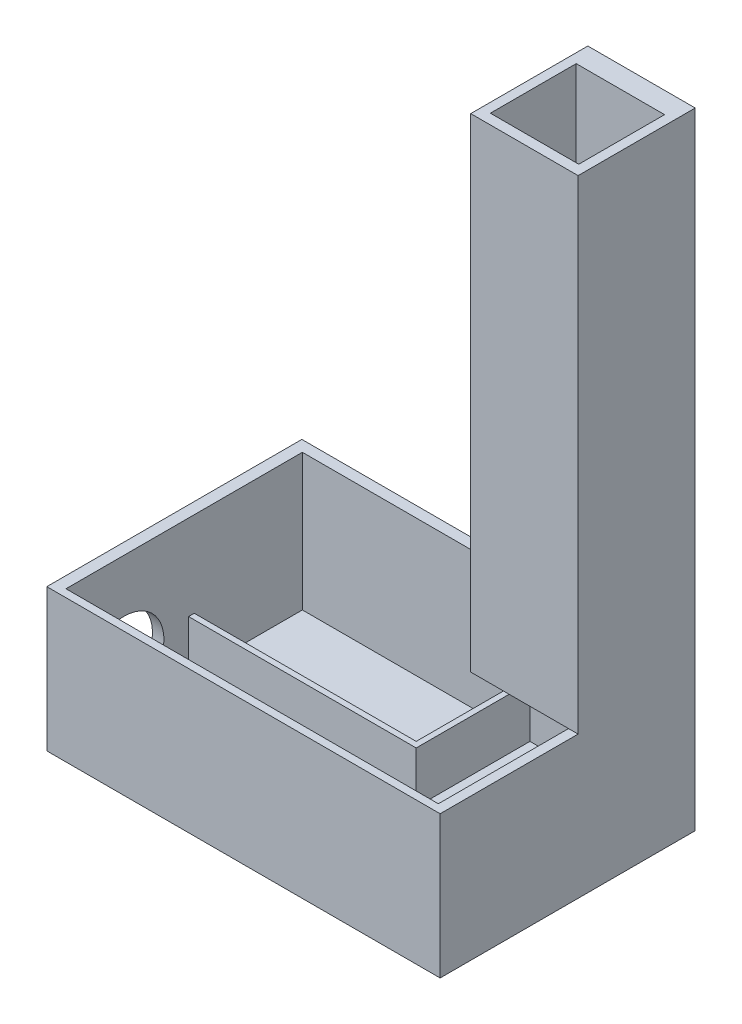
ISO-10303-21;
HEADER;
FILE_DESCRIPTION(('STEP AP214'),'2;1');
FILE_NAME('part.step','',(''),(''),'','','');
FILE_SCHEMA(('AUTOMOTIVE_DESIGN { 1 0 10303 214 1 1 1 1 }'));
ENDSEC;
DATA;
#1=APPLICATION_CONTEXT('core data for automotive mechanical design processes');
#2=APPLICATION_PROTOCOL_DEFINITION('international standard','automotive_design',2000,#1);
#3=PRODUCT_CONTEXT('',#1,'mechanical');
#4=PRODUCT('Part','Part','',(#3));
#5=PRODUCT_RELATED_PRODUCT_CATEGORY('part','',(#4));
#6=PRODUCT_DEFINITION_FORMATION('','',#4);
#7=PRODUCT_DEFINITION_CONTEXT('part definition',#1,'design');
#8=PRODUCT_DEFINITION('design','',#6,#7);
#9=PRODUCT_DEFINITION_SHAPE('','',#8);
#10=(LENGTH_UNIT() NAMED_UNIT(*) SI_UNIT(.MILLI.,.METRE.));
#11=(NAMED_UNIT(*) PLANE_ANGLE_UNIT() SI_UNIT($,.RADIAN.));
#12=(NAMED_UNIT(*) SI_UNIT($,.STERADIAN.) SOLID_ANGLE_UNIT());
#13=UNCERTAINTY_MEASURE_WITH_UNIT(LENGTH_MEASURE(1.E-05),#10,'distance_accuracy_value','');
#14=(GEOMETRIC_REPRESENTATION_CONTEXT(3) GLOBAL_UNCERTAINTY_ASSIGNED_CONTEXT((#13)) GLOBAL_UNIT_ASSIGNED_CONTEXT((#10,
#11,#12)) REPRESENTATION_CONTEXT('',''));
#15=CARTESIAN_POINT('',(0.,0.,0.));
#16=DIRECTION('',(0.,0.,1.));
#17=DIRECTION('',(1.,0.,0.));
#18=AXIS2_PLACEMENT_3D('',#15,#16,#17);
#19=CARTESIAN_POINT('',(0.,0.200000000000001,0.));
#20=DIRECTION('',(0.,1.,0.));
#21=DIRECTION('',(0.,0.,1.));
#22=AXIS2_PLACEMENT_3D('',#19,#20,#21);
#23=PLANE('',#22);
#24=DIRECTION('',(1.,0.,0.));
#25=VECTOR('',#24,1.);
#26=CARTESIAN_POINT('',(0.,0.200000000000001,4.18326309861247));
#27=LINE('',#26,#25);
#28=CARTESIAN_POINT('',(0.401261320917001,0.200000000000001,4.18326309861247));
#29=VERTEX_POINT('',#28);
#30=CARTESIAN_POINT('',(8.201261320917,0.200000000000001,4.18326309861247));
#31=VERTEX_POINT('',#30);
#32=EDGE_CURVE('E374',#29,#31,#27,.T.);
#33=ORIENTED_EDGE('',*,*,#32,.T.);
#34=DIRECTION('',(0.,0.,1.));
#35=VECTOR('',#34,1.);
#36=CARTESIAN_POINT('',(8.201261320917,0.200000000000001,0.));
#37=LINE('',#36,#35);
#38=CARTESIAN_POINT('',(8.201261320917,0.200000000000001,0.383263098612474));
#39=VERTEX_POINT('',#38);
#40=EDGE_CURVE('E371',#39,#31,#37,.T.);
#41=ORIENTED_EDGE('',*,*,#40,.F.);
#42=DIRECTION('',(-1.,0.,0.));
#43=VECTOR('',#42,1.);
#44=CARTESIAN_POINT('',(0.401261320917001,0.200000000000001,0.383263098612474));
#45=LINE('',#44,#43);
#46=CARTESIAN_POINT('',(0.401261320917001,0.200000000000001,0.383263098612474));
#47=VERTEX_POINT('',#46);
#48=EDGE_CURVE('E403',#39,#47,#45,.T.);
#49=ORIENTED_EDGE('',*,*,#48,.T.);
#50=DIRECTION('',(0.,0.,1.));
#51=VECTOR('',#50,1.);
#52=CARTESIAN_POINT('',(0.401261320917001,0.200000000000001,0.383263098612474));
#53=LINE('',#52,#51);
#54=EDGE_CURVE('E393',#47,#29,#53,.T.);
#55=ORIENTED_EDGE('',*,*,#54,.T.);
#56=EDGE_LOOP('',(#33,#41,#49,#55));
#57=FACE_BOUND('',#56,.T.);
#58=ADVANCED_FACE('F37',(#57),#23,.T.);
#59=CARTESIAN_POINT('',(0.,5.,0.));
#60=DIRECTION('',(1.,0.,0.));
#61=DIRECTION('',(0.,0.,-1.));
#62=AXIS2_PLACEMENT_3D('',#59,#60,#61);
#63=PLANE('',#62);
#64=CARTESIAN_POINT('',(0.,1.74231817794634,6.65194334569197));
#65=DIRECTION('',(-1.,0.,0.));
#66=DIRECTION('',(0.,0.,1.));
#67=AXIS2_PLACEMENT_3D('',#64,#65,#66);
#68=CIRCLE('',#67,1.4);
#69=CARTESIAN_POINT('',(0.,1.74231817794634,8.05194334569197));
#70=VERTEX_POINT('',#69);
#71=EDGE_CURVE('E342',#70,#70,#68,.T.);
#72=ORIENTED_EDGE('',*,*,#71,.F.);
#73=EDGE_LOOP('',(#72));
#74=FACE_BOUND('',#73,.T.);
#75=DIRECTION('',(0.,0.,1.));
#76=VECTOR('',#75,1.);
#77=CARTESIAN_POINT('',(0.,0.,0.));
#78=LINE('',#77,#76);
#79=CARTESIAN_POINT('',(0.,0.,0.));
#80=VERTEX_POINT('',#79);
#81=CARTESIAN_POINT('',(0.,0.,8.96494916138802));
#82=VERTEX_POINT('',#81);
#83=EDGE_CURVE('E423',#80,#82,#78,.T.);
#84=ORIENTED_EDGE('',*,*,#83,.T.);
#85=DIRECTION('',(0.,-1.,0.));
#86=VECTOR('',#85,1.);
#87=CARTESIAN_POINT('',(0.,5.,8.96494916138802));
#88=LINE('',#87,#86);
#89=CARTESIAN_POINT('',(0.,5.,8.96494916138802));
#90=VERTEX_POINT('',#89);
#91=EDGE_CURVE('E457',#90,#82,#88,.T.);
#92=ORIENTED_EDGE('',*,*,#91,.F.);
#93=DIRECTION('',(0.,0.,1.));
#94=VECTOR('',#93,1.);
#95=CARTESIAN_POINT('',(0.,5.,0.));
#96=LINE('',#95,#94);
#97=CARTESIAN_POINT('',(0.,5.,0.));
#98=VERTEX_POINT('',#97);
#99=EDGE_CURVE('E431',#98,#90,#96,.T.);
#100=ORIENTED_EDGE('',*,*,#99,.F.);
#101=DIRECTION('',(0.,-1.,0.));
#102=VECTOR('',#101,1.);
#103=CARTESIAN_POINT('',(0.,5.,0.));
#104=LINE('',#103,#102);
#105=EDGE_CURVE('E441',#98,#80,#104,.T.);
#106=ORIENTED_EDGE('',*,*,#105,.T.);
#107=EDGE_LOOP('',(#84,#92,#100,#106));
#108=FACE_BOUND('',#107,.T.);
#109=ADVANCED_FACE('F39',(#74,#108),#63,.F.);
#110=CARTESIAN_POINT('',(0.,5.,8.96494916138802));
#111=DIRECTION('',(0.,0.,-1.));
#112=DIRECTION('',(-1.,0.,0.));
#113=AXIS2_PLACEMENT_3D('',#110,#111,#112);
#114=PLANE('',#113);
#115=DIRECTION('',(1.,0.,0.));
#116=VECTOR('',#115,1.);
#117=CARTESIAN_POINT('',(0.,0.,8.96494916138802));
#118=LINE('',#117,#116);
#119=CARTESIAN_POINT('',(13.824903870647,0.,8.96494916138802));
#120=VERTEX_POINT('',#119);
#121=EDGE_CURVE('E444',#82,#120,#118,.T.);
#122=ORIENTED_EDGE('',*,*,#121,.T.);
#123=DIRECTION('',(0.,-1.,0.));
#124=VECTOR('',#123,1.);
#125=CARTESIAN_POINT('',(13.824903870647,5.,8.96494916138802));
#126=LINE('',#125,#124);
#127=CARTESIAN_POINT('',(13.824903870647,5.,8.96494916138802));
#128=VERTEX_POINT('',#127);
#129=EDGE_CURVE('E454',#128,#120,#126,.T.);
#130=ORIENTED_EDGE('',*,*,#129,.F.);
#131=DIRECTION('',(1.,0.,0.));
#132=VECTOR('',#131,1.);
#133=CARTESIAN_POINT('',(0.,5.,8.96494916138802));
#134=LINE('',#133,#132);
#135=EDGE_CURVE('E434',#90,#128,#134,.T.);
#136=ORIENTED_EDGE('',*,*,#135,.F.);
#137=ORIENTED_EDGE('',*,*,#91,.T.);
#138=EDGE_LOOP('',(#122,#130,#136,#137));
#139=FACE_BOUND('',#138,.T.);
#140=ADVANCED_FACE('F491',(#139),#114,.F.);
#141=CARTESIAN_POINT('',(13.824903870647,5.,0.));
#142=DIRECTION('',(-1.,0.,0.));
#143=DIRECTION('',(0.,0.,1.));
#144=AXIS2_PLACEMENT_3D('',#141,#142,#143);
#145=PLANE('',#144);
#146=DIRECTION('',(0.,0.,-1.));
#147=VECTOR('',#146,1.);
#148=CARTESIAN_POINT('',(13.824903870647,0.,0.));
#149=LINE('',#148,#147);
#150=CARTESIAN_POINT('',(13.824903870647,0.,0.));
#151=VERTEX_POINT('',#150);
#152=EDGE_CURVE('E446',#120,#151,#149,.T.);
#153=ORIENTED_EDGE('',*,*,#152,.T.);
#154=DIRECTION('',(0.,-1.,0.));
#155=VECTOR('',#154,1.);
#156=CARTESIAN_POINT('',(13.824903870647,5.,0.));
#157=LINE('',#156,#155);
#158=CARTESIAN_POINT('',(13.824903870647,22.,0.));
#159=VERTEX_POINT('',#158);
#160=EDGE_CURVE('E451',#159,#151,#157,.T.);
#161=ORIENTED_EDGE('',*,*,#160,.F.);
#162=DIRECTION('',(0.,0.,-1.));
#163=VECTOR('',#162,1.);
#164=CARTESIAN_POINT('',(13.824903870647,22.,4.11558083447616));
#165=LINE('',#164,#163);
#166=CARTESIAN_POINT('',(13.824903870647,22.,4.11558083447616));
#167=VERTEX_POINT('',#166);
#168=EDGE_CURVE('E291',#167,#159,#165,.T.);
#169=ORIENTED_EDGE('',*,*,#168,.F.);
#170=DIRECTION('',(0.,-1.,0.));
#171=VECTOR('',#170,1.);
#172=CARTESIAN_POINT('',(13.824903870647,22.,4.11558083447616));
#173=LINE('',#172,#171);
#174=CARTESIAN_POINT('',(13.824903870647,5.,4.11558083447616));
#175=VERTEX_POINT('',#174);
#176=EDGE_CURVE('E301',#167,#175,#173,.T.);
#177=ORIENTED_EDGE('',*,*,#176,.T.);
#178=DIRECTION('',(0.,0.,-1.));
#179=VECTOR('',#178,1.);
#180=CARTESIAN_POINT('',(13.824903870647,5.,0.));
#181=LINE('',#180,#179);
#182=EDGE_CURVE('E437',#128,#175,#181,.T.);
#183=ORIENTED_EDGE('',*,*,#182,.F.);
#184=ORIENTED_EDGE('',*,*,#129,.T.);
#185=EDGE_LOOP('',(#153,#161,#169,#177,#183,#184));
#186=FACE_BOUND('',#185,.T.);
#187=ADVANCED_FACE('F662',(#186),#145,.F.);
#188=CARTESIAN_POINT('',(0.,5.,0.));
#189=DIRECTION('',(0.,0.,1.));
#190=DIRECTION('',(1.,0.,0.));
#191=AXIS2_PLACEMENT_3D('',#188,#189,#190);
#192=PLANE('',#191);
#193=DIRECTION('',(0.,1.,0.));
#194=VECTOR('',#193,1.);
#195=CARTESIAN_POINT('',(10.0509271996998,4.93960678409167,0.));
#196=LINE('',#195,#194);
#197=CARTESIAN_POINT('',(10.0509271996998,4.4,0.));
#198=VERTEX_POINT('',#197);
#199=CARTESIAN_POINT('',(10.0509271996998,4.93960678409167,0.));
#200=VERTEX_POINT('',#199);
#201=EDGE_CURVE('E246',#198,#200,#196,.T.);
#202=ORIENTED_EDGE('',*,*,#201,.F.);
#203=DIRECTION('',(-1.,0.,0.));
#204=VECTOR('',#203,1.);
#205=CARTESIAN_POINT('',(13.366594901953,4.4,0.));
#206=LINE('',#205,#204);
#207=CARTESIAN_POINT('',(13.366594901953,4.4,0.));
#208=VERTEX_POINT('',#207);
#209=EDGE_CURVE('E52',#208,#198,#206,.T.);
#210=ORIENTED_EDGE('',*,*,#209,.F.);
#211=DIRECTION('',(0.,-1.,0.));
#212=VECTOR('',#211,1.);
#213=CARTESIAN_POINT('',(13.366594901953,4.93960678409167,0.));
#214=LINE('',#213,#212);
#215=CARTESIAN_POINT('',(13.366594901953,4.93960678409167,0.));
#216=VERTEX_POINT('',#215);
#217=EDGE_CURVE('E253',#216,#208,#214,.T.);
#218=ORIENTED_EDGE('',*,*,#217,.F.);
#219=DIRECTION('',(1.,0.,0.));
#220=VECTOR('',#219,1.);
#221=CARTESIAN_POINT('',(10.0509271996998,4.93960678409167,0.));
#222=LINE('',#221,#220);
#223=EDGE_CURVE('E237',#200,#216,#222,.T.);
#224=ORIENTED_EDGE('',*,*,#223,.F.);
#225=EDGE_LOOP('',(#202,#210,#218,#224));
#226=FACE_BOUND('',#225,.T.);
#227=DIRECTION('',(-1.,0.,0.));
#228=VECTOR('',#227,1.);
#229=CARTESIAN_POINT('',(0.,0.,0.));
#230=LINE('',#229,#228);
#231=EDGE_CURVE('E435',#151,#80,#230,.T.);
#232=ORIENTED_EDGE('',*,*,#231,.T.);
#233=ORIENTED_EDGE('',*,*,#105,.F.);
#234=DIRECTION('',(-1.,0.,0.));
#235=VECTOR('',#234,1.);
#236=CARTESIAN_POINT('',(0.,5.,0.));
#237=LINE('',#236,#235);
#238=CARTESIAN_POINT('',(10.0509271996998,5.,0.));
#239=VERTEX_POINT('',#238);
#240=EDGE_CURVE('E439',#239,#98,#237,.T.);
#241=ORIENTED_EDGE('',*,*,#240,.F.);
#242=DIRECTION('',(0.,-1.,0.));
#243=VECTOR('',#242,1.);
#244=CARTESIAN_POINT('',(10.0509271996998,22.,0.));
#245=LINE('',#244,#243);
#246=CARTESIAN_POINT('',(10.0509271996998,22.,0.));
#247=VERTEX_POINT('',#246);
#248=EDGE_CURVE('E313',#247,#239,#245,.T.);
#249=ORIENTED_EDGE('',*,*,#248,.F.);
#250=DIRECTION('',(-1.,0.,0.));
#251=VECTOR('',#250,1.);
#252=CARTESIAN_POINT('',(13.824903870647,22.,0.));
#253=LINE('',#252,#251);
#254=EDGE_CURVE('E294',#159,#247,#253,.T.);
#255=ORIENTED_EDGE('',*,*,#254,.F.);
#256=ORIENTED_EDGE('',*,*,#160,.T.);
#257=EDGE_LOOP('',(#232,#233,#241,#249,#255,#256));
#258=FACE_BOUND('',#257,.T.);
#259=ADVANCED_FACE('F250',(#226,#258),#192,.F.);
#260=CARTESIAN_POINT('',(0.,5.,0.));
#261=DIRECTION('',(0.,1.,0.));
#262=DIRECTION('',(0.,0.,1.));
#263=AXIS2_PLACEMENT_3D('',#260,#261,#262);
#264=PLANE('',#263);
#265=DIRECTION('',(1.,0.,0.));
#266=VECTOR('',#265,1.);
#267=CARTESIAN_POINT('',(13.489870245408,5.,4.11558083447616));
#268=LINE('',#267,#266);
#269=CARTESIAN_POINT('',(13.489870245408,5.,4.11558083447616));
#270=VERTEX_POINT('',#269);
#271=EDGE_CURVE('E307',#270,#175,#268,.T.);
#272=ORIENTED_EDGE('',*,*,#271,.F.);
#273=DIRECTION('',(0.,0.,-1.));
#274=VECTOR('',#273,1.);
#275=CARTESIAN_POINT('',(13.489870245408,5.,0.383263098612474));
#276=LINE('',#275,#274);
#277=CARTESIAN_POINT('',(13.489870245408,5.,8.69269012127916));
#278=VERTEX_POINT('',#277);
#279=EDGE_CURVE('E413',#278,#270,#276,.T.);
#280=ORIENTED_EDGE('',*,*,#279,.F.);
#281=DIRECTION('',(1.,0.,0.));
#282=VECTOR('',#281,1.);
#283=CARTESIAN_POINT('',(0.401261320917001,5.,8.69269012127916));
#284=LINE('',#283,#282);
#285=CARTESIAN_POINT('',(0.401261320917001,5.,8.69269012127916));
#286=VERTEX_POINT('',#285);
#287=EDGE_CURVE('E409',#286,#278,#284,.T.);
#288=ORIENTED_EDGE('',*,*,#287,.F.);
#289=DIRECTION('',(0.,0.,1.));
#290=VECTOR('',#289,1.);
#291=CARTESIAN_POINT('',(0.401261320917001,5.,0.383263098612474));
#292=LINE('',#291,#290);
#293=CARTESIAN_POINT('',(0.401261320917001,5.,0.383263098612474));
#294=VERTEX_POINT('',#293);
#295=EDGE_CURVE('E392',#294,#286,#292,.T.);
#296=ORIENTED_EDGE('',*,*,#295,.F.);
#297=DIRECTION('',(-1.,0.,0.));
#298=VECTOR('',#297,1.);
#299=CARTESIAN_POINT('',(0.401261320917001,5.,0.383263098612474));
#300=LINE('',#299,#298);
#301=CARTESIAN_POINT('',(10.0509271996998,5.,0.383263098612476));
#302=VERTEX_POINT('',#301);
#303=EDGE_CURVE('E416',#302,#294,#300,.T.);
#304=ORIENTED_EDGE('',*,*,#303,.F.);
#305=DIRECTION('',(0.,0.,1.));
#306=VECTOR('',#305,1.);
#307=CARTESIAN_POINT('',(10.0509271996998,5.,4.11558083447616));
#308=LINE('',#307,#306);
#309=EDGE_CURVE('E302',#239,#302,#308,.T.);
#310=ORIENTED_EDGE('',*,*,#309,.F.);
#311=ORIENTED_EDGE('',*,*,#240,.T.);
#312=ORIENTED_EDGE('',*,*,#99,.T.);
#313=ORIENTED_EDGE('',*,*,#135,.T.);
#314=ORIENTED_EDGE('',*,*,#182,.T.);
#315=EDGE_LOOP('',(#272,#280,#288,#296,#304,#310,#311,#312,#313,#314));
#316=FACE_BOUND('',#315,.T.);
#317=ADVANCED_FACE('F607',(#316),#264,.T.);
#318=CARTESIAN_POINT('',(0.,0.,0.));
#319=DIRECTION('',(0.,1.,0.));
#320=DIRECTION('',(0.,0.,1.));
#321=AXIS2_PLACEMENT_3D('',#318,#319,#320);
#322=PLANE('',#321);
#323=DIRECTION('',(1.,0.,0.));
#324=VECTOR('',#323,1.);
#325=CARTESIAN_POINT('',(13.05875444584,0.,8.31226281930242));
#326=LINE('',#325,#324);
#327=CARTESIAN_POINT('',(12.6179511798057,0.,8.31226281930242));
#328=VERTEX_POINT('',#327);
#329=CARTESIAN_POINT('',(13.05875444584,0.,8.31226281930242));
#330=VERTEX_POINT('',#329);
#331=EDGE_CURVE('E327',#328,#330,#326,.T.);
#332=ORIENTED_EDGE('',*,*,#331,.T.);
#333=DIRECTION('',(0.,0.,-1.));
#334=VECTOR('',#333,1.);
#335=CARTESIAN_POINT('',(13.05875444584,0.,8.31226281930242));
#336=LINE('',#335,#334);
#337=CARTESIAN_POINT('',(13.05875444584,0.,6.04157629305746));
#338=VERTEX_POINT('',#337);
#339=EDGE_CURVE('E317',#330,#338,#336,.T.);
#340=ORIENTED_EDGE('',*,*,#339,.T.);
#341=DIRECTION('',(-1.,0.,0.));
#342=VECTOR('',#341,1.);
#343=CARTESIAN_POINT('',(13.05875444584,0.,6.04157629305746));
#344=LINE('',#343,#342);
#345=CARTESIAN_POINT('',(12.6179511798057,0.,6.04157629305746));
#346=VERTEX_POINT('',#345);
#347=EDGE_CURVE('E320',#338,#346,#344,.T.);
#348=ORIENTED_EDGE('',*,*,#347,.T.);
#349=DIRECTION('',(0.,0.,1.));
#350=VECTOR('',#349,1.);
#351=CARTESIAN_POINT('',(12.6179511798057,0.,8.31226281930242));
#352=LINE('',#351,#350);
#353=EDGE_CURVE('E324',#346,#328,#352,.T.);
#354=ORIENTED_EDGE('',*,*,#353,.T.);
#355=EDGE_LOOP('',(#332,#340,#348,#354));
#356=FACE_BOUND('',#355,.T.);
#357=ORIENTED_EDGE('',*,*,#83,.F.);
#358=ORIENTED_EDGE('',*,*,#231,.F.);
#359=ORIENTED_EDGE('',*,*,#152,.F.);
#360=ORIENTED_EDGE('',*,*,#121,.F.);
#361=EDGE_LOOP('',(#357,#358,#359,#360));
#362=FACE_BOUND('',#361,.T.);
#363=ADVANCED_FACE('F587',(#356,#362),#322,.F.);
#364=CARTESIAN_POINT('',(0.401261320917001,0.200000000000001,0.383263098612474));
#365=DIRECTION('',(-1.,0.,0.));
#366=DIRECTION('',(0.,0.,1.));
#367=AXIS2_PLACEMENT_3D('',#364,#365,#366);
#368=PLANE('',#367);
#369=CARTESIAN_POINT('',(0.401261320917001,1.74231817794634,6.65194334569197));
#370=DIRECTION('',(-1.,0.,0.));
#371=DIRECTION('',(0.,0.,1.));
#372=AXIS2_PLACEMENT_3D('',#369,#370,#371);
#373=CIRCLE('',#372,1.4);
#374=CARTESIAN_POINT('',(0.401261320917001,1.74231817794634,8.05194334569197));
#375=VERTEX_POINT('',#374);
#376=EDGE_CURVE('E351',#375,#375,#373,.T.);
#377=ORIENTED_EDGE('',*,*,#376,.T.);
#378=EDGE_LOOP('',(#377));
#379=FACE_BOUND('',#378,.T.);
#380=DIRECTION('',(0.,0.,1.));
#381=VECTOR('',#380,1.);
#382=CARTESIAN_POINT('',(0.401261320917001,2.,0.));
#383=LINE('',#382,#381);
#384=CARTESIAN_POINT('',(0.401261320917001,2.,4.18326309861247));
#385=VERTEX_POINT('',#384);
#386=CARTESIAN_POINT('',(0.401261320917001,2.,4.38326309861247));
#387=VERTEX_POINT('',#386);
#388=EDGE_CURVE('E363',#385,#387,#383,.T.);
#389=ORIENTED_EDGE('',*,*,#388,.F.);
#390=DIRECTION('',(0.,-1.,0.));
#391=VECTOR('',#390,1.);
#392=CARTESIAN_POINT('',(0.401261320917001,2.,4.18326309861247));
#393=LINE('',#392,#391);
#394=EDGE_CURVE('E382',#385,#29,#393,.T.);
#395=ORIENTED_EDGE('',*,*,#394,.T.);
#396=ORIENTED_EDGE('',*,*,#54,.F.);
#397=DIRECTION('',(0.,1.,0.));
#398=VECTOR('',#397,1.);
#399=CARTESIAN_POINT('',(0.401261320917001,0.200000000000001,0.383263098612474));
#400=LINE('',#399,#398);
#401=EDGE_CURVE('E420',#47,#294,#400,.T.);
#402=ORIENTED_EDGE('',*,*,#401,.T.);
#403=ORIENTED_EDGE('',*,*,#295,.T.);
#404=DIRECTION('',(0.,1.,0.));
#405=VECTOR('',#404,1.);
#406=CARTESIAN_POINT('',(0.401261320917001,0.200000000000001,8.69269012127916));
#407=LINE('',#406,#405);
#408=CARTESIAN_POINT('',(0.401261320917001,0.200000000000001,8.69269012127916));
#409=VERTEX_POINT('',#408);
#410=EDGE_CURVE('E407',#409,#286,#407,.T.);
#411=ORIENTED_EDGE('',*,*,#410,.F.);
#412=CARTESIAN_POINT('',(0.401261320917001,0.200000000000001,4.38326309861247));
#413=VERTEX_POINT('',#412);
#414=EDGE_CURVE('E397',#413,#409,#53,.T.);
#415=ORIENTED_EDGE('',*,*,#414,.F.);
#416=DIRECTION('',(0.,-1.,0.));
#417=VECTOR('',#416,1.);
#418=CARTESIAN_POINT('',(0.401261320917001,2.,4.38326309861247));
#419=LINE('',#418,#417);
#420=EDGE_CURVE('E380',#387,#413,#419,.T.);
#421=ORIENTED_EDGE('',*,*,#420,.F.);
#422=EDGE_LOOP('',(#389,#395,#396,#402,#403,#411,#415,#421));
#423=FACE_BOUND('',#422,.T.);
#424=ADVANCED_FACE('F533',(#379,#423),#368,.F.);
#425=CARTESIAN_POINT('',(0.401261320917001,0.200000000000001,0.383263098612474));
#426=DIRECTION('',(0.,0.,-1.));
#427=DIRECTION('',(-1.,0.,0.));
#428=AXIS2_PLACEMENT_3D('',#425,#426,#427);
#429=PLANE('',#428);
#430=DIRECTION('',(0.,-1.,0.));
#431=VECTOR('',#430,1.);
#432=CARTESIAN_POINT('',(13.366594901953,0.200000000000001,0.383263098612474));
#433=LINE('',#432,#431);
#434=CARTESIAN_POINT('',(13.366594901953,4.93960678409167,0.383263098612474));
#435=VERTEX_POINT('',#434);
#436=CARTESIAN_POINT('',(13.366594901953,4.4,0.383263098612474));
#437=VERTEX_POINT('',#436);
#438=EDGE_CURVE('E45',#435,#437,#433,.T.);
#439=ORIENTED_EDGE('',*,*,#438,.T.);
#440=DIRECTION('',(-1.,0.,0.));
#441=VECTOR('',#440,1.);
#442=CARTESIAN_POINT('',(0.401261320917002,4.4,0.383263098612474));
#443=LINE('',#442,#441);
#444=CARTESIAN_POINT('',(10.0509271996998,4.4,0.383263098612474));
#445=VERTEX_POINT('',#444);
#446=EDGE_CURVE('E11',#437,#445,#443,.T.);
#447=ORIENTED_EDGE('',*,*,#446,.T.);
#448=DIRECTION('',(0.,1.,0.));
#449=VECTOR('',#448,1.);
#450=CARTESIAN_POINT('',(10.0509271996998,0.200000000000001,0.383263098612474));
#451=LINE('',#450,#449);
#452=CARTESIAN_POINT('',(10.0509271996998,4.93960678409167,0.383263098612474));
#453=VERTEX_POINT('',#452);
#454=EDGE_CURVE('E462',#445,#453,#451,.T.);
#455=ORIENTED_EDGE('',*,*,#454,.T.);
#456=DIRECTION('',(1.,0.,0.));
#457=VECTOR('',#456,1.);
#458=CARTESIAN_POINT('',(0.401261320917001,4.93960678409167,0.383263098612474));
#459=LINE('',#458,#457);
#460=EDGE_CURVE('E240',#453,#435,#459,.T.);
#461=ORIENTED_EDGE('',*,*,#460,.T.);
#462=EDGE_LOOP('',(#439,#447,#455,#461));
#463=FACE_BOUND('',#462,.T.);
#464=DIRECTION('',(-1.,0.,0.));
#465=VECTOR('',#464,1.);
#466=CARTESIAN_POINT('',(0.,2.,0.383263098612474));
#467=LINE('',#466,#465);
#468=CARTESIAN_POINT('',(8.401261320917,2.,0.383263098612474));
#469=VERTEX_POINT('',#468);
#470=CARTESIAN_POINT('',(8.201261320917,2.,0.383263098612474));
#471=VERTEX_POINT('',#470);
#472=EDGE_CURVE('E355',#469,#471,#467,.T.);
#473=ORIENTED_EDGE('',*,*,#472,.F.);
#474=DIRECTION('',(0.,-1.,0.));
#475=VECTOR('',#474,1.);
#476=CARTESIAN_POINT('',(8.401261320917,2.,0.383263098612474));
#477=LINE('',#476,#475);
#478=CARTESIAN_POINT('',(8.401261320917,0.200000000000001,0.383263098612474));
#479=VERTEX_POINT('',#478);
#480=EDGE_CURVE('E389',#469,#479,#477,.T.);
#481=ORIENTED_EDGE('',*,*,#480,.T.);
#482=CARTESIAN_POINT('',(13.489870245408,0.200000000000001,0.383263098612474));
#483=VERTEX_POINT('',#482);
#484=EDGE_CURVE('E404',#483,#479,#45,.T.);
#485=ORIENTED_EDGE('',*,*,#484,.F.);
#486=DIRECTION('',(0.,1.,0.));
#487=VECTOR('',#486,1.);
#488=CARTESIAN_POINT('',(13.489870245408,0.200000000000001,0.383263098612474));
#489=LINE('',#488,#487);
#490=CARTESIAN_POINT('',(13.489870245408,5.,0.383263098612474));
#491=VERTEX_POINT('',#490);
#492=EDGE_CURVE('E424',#483,#491,#489,.T.);
#493=ORIENTED_EDGE('',*,*,#492,.T.);
#494=EDGE_CURVE('E418',#491,#302,#300,.T.);
#495=ORIENTED_EDGE('',*,*,#494,.T.);
#496=ORIENTED_EDGE('',*,*,#303,.T.);
#497=ORIENTED_EDGE('',*,*,#401,.F.);
#498=ORIENTED_EDGE('',*,*,#48,.F.);
#499=DIRECTION('',(0.,-1.,0.));
#500=VECTOR('',#499,1.);
#501=CARTESIAN_POINT('',(8.201261320917,2.,0.383263098612474));
#502=LINE('',#501,#500);
#503=EDGE_CURVE('E387',#471,#39,#502,.T.);
#504=ORIENTED_EDGE('',*,*,#503,.F.);
#505=EDGE_LOOP('',(#473,#481,#485,#493,#495,#496,#497,#498,#504));
#506=FACE_BOUND('',#505,.T.);
#507=ADVANCED_FACE('F466',(#463,#506),#429,.F.);
#508=CARTESIAN_POINT('',(13.489870245408,0.200000000000001,0.383263098612474));
#509=DIRECTION('',(1.,0.,0.));
#510=DIRECTION('',(0.,0.,-1.));
#511=AXIS2_PLACEMENT_3D('',#508,#509,#510);
#512=PLANE('',#511);
#513=ORIENTED_EDGE('',*,*,#279,.T.);
#514=CARTESIAN_POINT('',(13.489870245408,5.,3.75798452995646));
#515=VERTEX_POINT('',#514);
#516=EDGE_CURVE('E417',#270,#515,#276,.T.);
#517=ORIENTED_EDGE('',*,*,#516,.T.);
#518=DIRECTION('',(0.,-1.,0.));
#519=VECTOR('',#518,1.);
#520=CARTESIAN_POINT('',(13.489870245408,22.,3.75798452995646));
#521=LINE('',#520,#519);
#522=CARTESIAN_POINT('',(13.489870245408,22.,3.75798452995646));
#523=VERTEX_POINT('',#522);
#524=EDGE_CURVE('E273',#523,#515,#521,.T.);
#525=ORIENTED_EDGE('',*,*,#524,.F.);
#526=DIRECTION('',(0.,0.,-1.));
#527=VECTOR('',#526,1.);
#528=CARTESIAN_POINT('',(13.489870245408,22.,0.74056553040336));
#529=LINE('',#528,#527);
#530=CARTESIAN_POINT('',(13.489870245408,22.,0.74056553040336));
#531=VERTEX_POINT('',#530);
#532=EDGE_CURVE('E263',#523,#531,#529,.T.);
#533=ORIENTED_EDGE('',*,*,#532,.T.);
#534=DIRECTION('',(0.,-1.,0.));
#535=VECTOR('',#534,1.);
#536=CARTESIAN_POINT('',(13.489870245408,22.,0.74056553040336));
#537=LINE('',#536,#535);
#538=CARTESIAN_POINT('',(13.489870245408,5.,0.74056553040336));
#539=VERTEX_POINT('',#538);
#540=EDGE_CURVE('E287',#531,#539,#537,.T.);
#541=ORIENTED_EDGE('',*,*,#540,.T.);
#542=EDGE_CURVE('E412',#539,#491,#276,.T.);
#543=ORIENTED_EDGE('',*,*,#542,.T.);
#544=ORIENTED_EDGE('',*,*,#492,.F.);
#545=DIRECTION('',(0.,0.,-1.));
#546=VECTOR('',#545,1.);
#547=CARTESIAN_POINT('',(13.489870245408,0.200000000000001,0.383263098612474));
#548=LINE('',#547,#546);
#549=CARTESIAN_POINT('',(13.489870245408,0.200000000000001,8.69269012127916));
#550=VERTEX_POINT('',#549);
#551=EDGE_CURVE('E400',#550,#483,#548,.T.);
#552=ORIENTED_EDGE('',*,*,#551,.F.);
#553=DIRECTION('',(0.,1.,0.));
#554=VECTOR('',#553,1.);
#555=CARTESIAN_POINT('',(13.489870245408,0.200000000000001,8.69269012127916));
#556=LINE('',#555,#554);
#557=EDGE_CURVE('E427',#550,#278,#556,.T.);
#558=ORIENTED_EDGE('',*,*,#557,.T.);
#559=EDGE_LOOP('',(#513,#517,#525,#533,#541,#543,#544,#552,#558));
#560=FACE_BOUND('',#559,.T.);
#561=ADVANCED_FACE('F505',(#560),#512,.F.);
#562=CARTESIAN_POINT('',(0.401261320917001,0.200000000000001,8.69269012127916));
#563=DIRECTION('',(0.,0.,1.));
#564=DIRECTION('',(1.,0.,0.));
#565=AXIS2_PLACEMENT_3D('',#562,#563,#564);
#566=PLANE('',#565);
#567=ORIENTED_EDGE('',*,*,#287,.T.);
#568=ORIENTED_EDGE('',*,*,#557,.F.);
#569=DIRECTION('',(1.,0.,0.));
#570=VECTOR('',#569,1.);
#571=CARTESIAN_POINT('',(0.401261320917001,0.200000000000001,8.69269012127916));
#572=LINE('',#571,#570);
#573=EDGE_CURVE('E396',#409,#550,#572,.T.);
#574=ORIENTED_EDGE('',*,*,#573,.F.);
#575=ORIENTED_EDGE('',*,*,#410,.T.);
#576=EDGE_LOOP('',(#567,#568,#574,#575));
#577=FACE_BOUND('',#576,.T.);
#578=ADVANCED_FACE('F497',(#577),#566,.F.);
#579=DIRECTION('',(0.,0.,-1.));
#580=VECTOR('',#579,1.);
#581=CARTESIAN_POINT('',(13.05875444584,0.200000000000001,8.31226281930242));
#582=LINE('',#581,#580);
#583=CARTESIAN_POINT('',(13.05875444584,0.200000000000001,8.31226281930242));
#584=VERTEX_POINT('',#583);
#585=CARTESIAN_POINT('',(13.05875444584,0.200000000000001,6.04157629305746));
#586=VERTEX_POINT('',#585);
#587=EDGE_CURVE('E316',#584,#586,#582,.T.);
#588=ORIENTED_EDGE('',*,*,#587,.F.);
#589=DIRECTION('',(1.,0.,0.));
#590=VECTOR('',#589,1.);
#591=CARTESIAN_POINT('',(13.05875444584,0.200000000000001,8.31226281930242));
#592=LINE('',#591,#590);
#593=CARTESIAN_POINT('',(12.6179511798057,0.200000000000001,8.31226281930242));
#594=VERTEX_POINT('',#593);
#595=EDGE_CURVE('E321',#594,#584,#592,.T.);
#596=ORIENTED_EDGE('',*,*,#595,.F.);
#597=DIRECTION('',(0.,0.,1.));
#598=VECTOR('',#597,1.);
#599=CARTESIAN_POINT('',(12.6179511798057,0.200000000000001,8.31226281930242));
#600=LINE('',#599,#598);
#601=CARTESIAN_POINT('',(12.6179511798057,0.200000000000001,6.04157629305746));
#602=VERTEX_POINT('',#601);
#603=EDGE_CURVE('E335',#602,#594,#600,.T.);
#604=ORIENTED_EDGE('',*,*,#603,.F.);
#605=DIRECTION('',(-1.,0.,0.));
#606=VECTOR('',#605,1.);
#607=CARTESIAN_POINT('',(13.05875444584,0.200000000000001,6.04157629305746));
#608=LINE('',#607,#606);
#609=EDGE_CURVE('E332',#586,#602,#608,.T.);
#610=ORIENTED_EDGE('',*,*,#609,.F.);
#611=EDGE_LOOP('',(#588,#596,#604,#610));
#612=FACE_BOUND('',#611,.T.);
#613=DIRECTION('',(0.,0.,1.));
#614=VECTOR('',#613,1.);
#615=CARTESIAN_POINT('',(8.401261320917,0.200000000000001,0.));
#616=LINE('',#615,#614);
#617=CARTESIAN_POINT('',(8.401261320917,0.200000000000001,4.38326309861247));
#618=VERTEX_POINT('',#617);
#619=EDGE_CURVE('E368',#479,#618,#616,.T.);
#620=ORIENTED_EDGE('',*,*,#619,.T.);
#621=DIRECTION('',(1.,0.,0.));
#622=VECTOR('',#621,1.);
#623=CARTESIAN_POINT('',(0.,0.200000000000001,4.38326309861247));
#624=LINE('',#623,#622);
#625=EDGE_CURVE('E356',#413,#618,#624,.T.);
#626=ORIENTED_EDGE('',*,*,#625,.F.);
#627=ORIENTED_EDGE('',*,*,#414,.T.);
#628=ORIENTED_EDGE('',*,*,#573,.T.);
#629=ORIENTED_EDGE('',*,*,#551,.T.);
#630=ORIENTED_EDGE('',*,*,#484,.T.);
#631=EDGE_LOOP('',(#620,#626,#627,#628,#629,#630));
#632=FACE_BOUND('',#631,.T.);
#633=ADVANCED_FACE('F487',(#612,#632),#23,.T.);
#634=CARTESIAN_POINT('',(8.401261320917,2.,0.));
#635=DIRECTION('',(1.,0.,0.));
#636=DIRECTION('',(0.,0.,-1.));
#637=AXIS2_PLACEMENT_3D('',#634,#635,#636);
#638=PLANE('',#637);
#639=ORIENTED_EDGE('',*,*,#619,.F.);
#640=ORIENTED_EDGE('',*,*,#480,.F.);
#641=DIRECTION('',(0.,0.,1.));
#642=VECTOR('',#641,1.);
#643=CARTESIAN_POINT('',(8.401261320917,2.,0.));
#644=LINE('',#643,#642);
#645=CARTESIAN_POINT('',(8.401261320917,2.,4.38326309861247));
#646=VERTEX_POINT('',#645);
#647=EDGE_CURVE('E352',#469,#646,#644,.T.);
#648=ORIENTED_EDGE('',*,*,#647,.T.);
#649=DIRECTION('',(0.,-1.,0.));
#650=VECTOR('',#649,1.);
#651=CARTESIAN_POINT('',(8.401261320917,2.,4.38326309861247));
#652=LINE('',#651,#650);
#653=EDGE_CURVE('E367',#646,#618,#652,.T.);
#654=ORIENTED_EDGE('',*,*,#653,.T.);
#655=EDGE_LOOP('',(#639,#640,#648,#654));
#656=FACE_BOUND('',#655,.T.);
#657=ADVANCED_FACE('F496',(#656),#638,.T.);
#658=CARTESIAN_POINT('',(8.201261320917,2.,0.));
#659=DIRECTION('',(1.,0.,0.));
#660=DIRECTION('',(0.,0.,-1.));
#661=AXIS2_PLACEMENT_3D('',#658,#659,#660);
#662=PLANE('',#661);
#663=ORIENTED_EDGE('',*,*,#40,.T.);
#664=DIRECTION('',(0.,-1.,0.));
#665=VECTOR('',#664,1.);
#666=CARTESIAN_POINT('',(8.201261320917,2.,4.18326309861247));
#667=LINE('',#666,#665);
#668=CARTESIAN_POINT('',(8.201261320917,2.,4.18326309861247));
#669=VERTEX_POINT('',#668);
#670=EDGE_CURVE('E385',#669,#31,#667,.T.);
#671=ORIENTED_EDGE('',*,*,#670,.F.);
#672=DIRECTION('',(0.,0.,1.));
#673=VECTOR('',#672,1.);
#674=CARTESIAN_POINT('',(8.201261320917,2.,0.));
#675=LINE('',#674,#673);
#676=EDGE_CURVE('E358',#471,#669,#675,.T.);
#677=ORIENTED_EDGE('',*,*,#676,.F.);
#678=ORIENTED_EDGE('',*,*,#503,.T.);
#679=EDGE_LOOP('',(#663,#671,#677,#678));
#680=FACE_BOUND('',#679,.T.);
#681=ADVANCED_FACE('F503',(#680),#662,.F.);
#682=CARTESIAN_POINT('',(0.,2.,4.18326309861247));
#683=DIRECTION('',(0.,0.,-1.));
#684=DIRECTION('',(-1.,0.,0.));
#685=AXIS2_PLACEMENT_3D('',#682,#683,#684);
#686=PLANE('',#685);
#687=ORIENTED_EDGE('',*,*,#32,.F.);
#688=ORIENTED_EDGE('',*,*,#394,.F.);
#689=DIRECTION('',(1.,0.,0.));
#690=VECTOR('',#689,1.);
#691=CARTESIAN_POINT('',(0.,2.,4.18326309861247));
#692=LINE('',#691,#690);
#693=EDGE_CURVE('E360',#385,#669,#692,.T.);
#694=ORIENTED_EDGE('',*,*,#693,.T.);
#695=ORIENTED_EDGE('',*,*,#670,.T.);
#696=EDGE_LOOP('',(#687,#688,#694,#695));
#697=FACE_BOUND('',#696,.T.);
#698=ADVANCED_FACE('F528',(#697),#686,.T.);
#699=CARTESIAN_POINT('',(0.,2.,4.38326309861247));
#700=DIRECTION('',(0.,0.,-1.));
#701=DIRECTION('',(-1.,0.,0.));
#702=AXIS2_PLACEMENT_3D('',#699,#700,#701);
#703=PLANE('',#702);
#704=ORIENTED_EDGE('',*,*,#625,.T.);
#705=ORIENTED_EDGE('',*,*,#653,.F.);
#706=DIRECTION('',(1.,0.,0.));
#707=VECTOR('',#706,1.);
#708=CARTESIAN_POINT('',(0.,2.,4.38326309861247));
#709=LINE('',#708,#707);
#710=EDGE_CURVE('E365',#387,#646,#709,.T.);
#711=ORIENTED_EDGE('',*,*,#710,.F.);
#712=ORIENTED_EDGE('',*,*,#420,.T.);
#713=EDGE_LOOP('',(#704,#705,#711,#712));
#714=FACE_BOUND('',#713,.T.);
#715=ADVANCED_FACE('F537',(#714),#703,.F.);
#716=CARTESIAN_POINT('',(0.,2.,0.));
#717=DIRECTION('',(0.,1.,0.));
#718=DIRECTION('',(0.,0.,1.));
#719=AXIS2_PLACEMENT_3D('',#716,#717,#718);
#720=PLANE('',#719);
#721=ORIENTED_EDGE('',*,*,#647,.F.);
#722=ORIENTED_EDGE('',*,*,#472,.T.);
#723=ORIENTED_EDGE('',*,*,#676,.T.);
#724=ORIENTED_EDGE('',*,*,#693,.F.);
#725=ORIENTED_EDGE('',*,*,#388,.T.);
#726=ORIENTED_EDGE('',*,*,#710,.T.);
#727=EDGE_LOOP('',(#721,#722,#723,#724,#725,#726));
#728=FACE_BOUND('',#727,.T.);
#729=ADVANCED_FACE('F522',(#728),#720,.T.);
#730=CARTESIAN_POINT('',(1.8,1.74231817794634,6.65194334569197));
#731=DIRECTION('',(-1.,0.,0.));
#732=DIRECTION('',(0.,0.,1.));
#733=AXIS2_PLACEMENT_3D('',#730,#731,#732);
#734=CYLINDRICAL_SURFACE('',#733,1.4);
#735=ORIENTED_EDGE('',*,*,#71,.T.);
#736=EDGE_LOOP('',(#735));
#737=FACE_BOUND('',#736,.T.);
#738=ORIENTED_EDGE('',*,*,#376,.F.);
#739=EDGE_LOOP('',(#738));
#740=FACE_BOUND('',#739,.T.);
#741=ADVANCED_FACE('F544',(#737,#740),#734,.F.);
#742=CARTESIAN_POINT('',(13.05875444584,0.,8.31226281930242));
#743=DIRECTION('',(1.,0.,0.));
#744=DIRECTION('',(0.,0.,-1.));
#745=AXIS2_PLACEMENT_3D('',#742,#743,#744);
#746=PLANE('',#745);
#747=ORIENTED_EDGE('',*,*,#587,.T.);
#748=DIRECTION('',(0.,1.,0.));
#749=VECTOR('',#748,1.);
#750=CARTESIAN_POINT('',(13.05875444584,0.,6.04157629305746));
#751=LINE('',#750,#749);
#752=EDGE_CURVE('E330',#338,#586,#751,.T.);
#753=ORIENTED_EDGE('',*,*,#752,.F.);
#754=ORIENTED_EDGE('',*,*,#339,.F.);
#755=DIRECTION('',(0.,1.,0.));
#756=VECTOR('',#755,1.);
#757=CARTESIAN_POINT('',(13.05875444584,0.,8.31226281930242));
#758=LINE('',#757,#756);
#759=EDGE_CURVE('E340',#330,#584,#758,.T.);
#760=ORIENTED_EDGE('',*,*,#759,.T.);
#761=EDGE_LOOP('',(#747,#753,#754,#760));
#762=FACE_BOUND('',#761,.T.);
#763=ADVANCED_FACE('F599',(#762),#746,.F.);
#764=CARTESIAN_POINT('',(13.05875444584,0.,8.31226281930242));
#765=DIRECTION('',(0.,0.,1.));
#766=DIRECTION('',(1.,0.,0.));
#767=AXIS2_PLACEMENT_3D('',#764,#765,#766);
#768=PLANE('',#767);
#769=ORIENTED_EDGE('',*,*,#595,.T.);
#770=ORIENTED_EDGE('',*,*,#759,.F.);
#771=ORIENTED_EDGE('',*,*,#331,.F.);
#772=DIRECTION('',(0.,1.,0.));
#773=VECTOR('',#772,1.);
#774=CARTESIAN_POINT('',(12.6179511798057,0.,8.31226281930242));
#775=LINE('',#774,#773);
#776=EDGE_CURVE('E343',#328,#594,#775,.T.);
#777=ORIENTED_EDGE('',*,*,#776,.T.);
#778=EDGE_LOOP('',(#769,#770,#771,#777));
#779=FACE_BOUND('',#778,.T.);
#780=ADVANCED_FACE('F624',(#779),#768,.F.);
#781=CARTESIAN_POINT('',(12.6179511798057,0.,8.31226281930242));
#782=DIRECTION('',(-1.,0.,0.));
#783=DIRECTION('',(0.,0.,1.));
#784=AXIS2_PLACEMENT_3D('',#781,#782,#783);
#785=PLANE('',#784);
#786=ORIENTED_EDGE('',*,*,#603,.T.);
#787=ORIENTED_EDGE('',*,*,#776,.F.);
#788=ORIENTED_EDGE('',*,*,#353,.F.);
#789=DIRECTION('',(0.,1.,0.));
#790=VECTOR('',#789,1.);
#791=CARTESIAN_POINT('',(12.6179511798057,0.,6.04157629305746));
#792=LINE('',#791,#790);
#793=EDGE_CURVE('E345',#346,#602,#792,.T.);
#794=ORIENTED_EDGE('',*,*,#793,.T.);
#795=EDGE_LOOP('',(#786,#787,#788,#794));
#796=FACE_BOUND('',#795,.T.);
#797=ADVANCED_FACE('F634',(#796),#785,.F.);
#798=CARTESIAN_POINT('',(13.05875444584,0.,6.04157629305746));
#799=DIRECTION('',(0.,0.,-1.));
#800=DIRECTION('',(-1.,0.,0.));
#801=AXIS2_PLACEMENT_3D('',#798,#799,#800);
#802=PLANE('',#801);
#803=ORIENTED_EDGE('',*,*,#609,.T.);
#804=ORIENTED_EDGE('',*,*,#793,.F.);
#805=ORIENTED_EDGE('',*,*,#347,.F.);
#806=ORIENTED_EDGE('',*,*,#752,.T.);
#807=EDGE_LOOP('',(#803,#804,#805,#806));
#808=FACE_BOUND('',#807,.T.);
#809=ADVANCED_FACE('F644',(#808),#802,.F.);
#810=CARTESIAN_POINT('',(0.,22.,0.));
#811=DIRECTION('',(0.,1.,0.));
#812=DIRECTION('',(0.,0.,1.));
#813=AXIS2_PLACEMENT_3D('',#810,#811,#812);
#814=PLANE('',#813);
#815=ORIENTED_EDGE('',*,*,#168,.T.);
#816=ORIENTED_EDGE('',*,*,#254,.T.);
#817=DIRECTION('',(0.,0.,1.));
#818=VECTOR('',#817,1.);
#819=CARTESIAN_POINT('',(10.0509271996998,22.,0.));
#820=LINE('',#819,#818);
#821=CARTESIAN_POINT('',(10.0509271996998,22.,4.11558083447616));
#822=VERTEX_POINT('',#821);
#823=EDGE_CURVE('E297',#247,#822,#820,.T.);
#824=ORIENTED_EDGE('',*,*,#823,.T.);
#825=DIRECTION('',(1.,0.,0.));
#826=VECTOR('',#825,1.);
#827=CARTESIAN_POINT('',(13.489870245408,22.,4.11558083447616));
#828=LINE('',#827,#826);
#829=EDGE_CURVE('E299',#822,#167,#828,.T.);
#830=ORIENTED_EDGE('',*,*,#829,.T.);
#831=EDGE_LOOP('',(#815,#816,#824,#830));
#832=FACE_BOUND('',#831,.T.);
#833=DIRECTION('',(-1.,0.,0.));
#834=VECTOR('',#833,1.);
#835=CARTESIAN_POINT('',(10.3832169150593,22.,0.74056553040336));
#836=LINE('',#835,#834);
#837=CARTESIAN_POINT('',(10.3832169150593,22.,0.74056553040336));
#838=VERTEX_POINT('',#837);
#839=EDGE_CURVE('E265',#531,#838,#836,.T.);
#840=ORIENTED_EDGE('',*,*,#839,.F.);
#841=ORIENTED_EDGE('',*,*,#532,.F.);
#842=DIRECTION('',(1.,0.,0.));
#843=VECTOR('',#842,1.);
#844=CARTESIAN_POINT('',(13.489870245408,22.,3.75798452995646));
#845=LINE('',#844,#843);
#846=CARTESIAN_POINT('',(10.3832169150593,22.,3.75798452995646));
#847=VERTEX_POINT('',#846);
#848=EDGE_CURVE('E271',#847,#523,#845,.T.);
#849=ORIENTED_EDGE('',*,*,#848,.F.);
#850=DIRECTION('',(0.,0.,1.));
#851=VECTOR('',#850,1.);
#852=CARTESIAN_POINT('',(10.3832169150593,22.,0.74056553040336));
#853=LINE('',#852,#851);
#854=EDGE_CURVE('E268',#838,#847,#853,.T.);
#855=ORIENTED_EDGE('',*,*,#854,.F.);
#856=EDGE_LOOP('',(#840,#841,#849,#855));
#857=FACE_BOUND('',#856,.T.);
#858=ADVANCED_FACE('F654',(#832,#857),#814,.T.);
#859=CARTESIAN_POINT('',(0.,5.,0.));
#860=DIRECTION('',(0.,1.,0.));
#861=DIRECTION('',(0.,0.,1.));
#862=AXIS2_PLACEMENT_3D('',#859,#860,#861);
#863=PLANE('',#862);
#864=ORIENTED_EDGE('',*,*,#516,.F.);
#865=CARTESIAN_POINT('',(10.0509271996998,5.,4.11558083447616));
#866=VERTEX_POINT('',#865);
#867=EDGE_CURVE('E295',#866,#270,#268,.T.);
#868=ORIENTED_EDGE('',*,*,#867,.F.);
#869=EDGE_CURVE('E290',#302,#866,#308,.T.);
#870=ORIENTED_EDGE('',*,*,#869,.F.);
#871=ORIENTED_EDGE('',*,*,#494,.F.);
#872=ORIENTED_EDGE('',*,*,#542,.F.);
#873=DIRECTION('',(-1.,0.,0.));
#874=VECTOR('',#873,1.);
#875=CARTESIAN_POINT('',(10.3832169150593,5.,0.74056553040336));
#876=LINE('',#875,#874);
#877=CARTESIAN_POINT('',(10.3832169150593,5.,0.74056553040336));
#878=VERTEX_POINT('',#877);
#879=EDGE_CURVE('E260',#539,#878,#876,.T.);
#880=ORIENTED_EDGE('',*,*,#879,.T.);
#881=DIRECTION('',(0.,0.,1.));
#882=VECTOR('',#881,1.);
#883=CARTESIAN_POINT('',(10.3832169150593,5.,0.74056553040336));
#884=LINE('',#883,#882);
#885=CARTESIAN_POINT('',(10.3832169150593,5.,3.75798452995646));
#886=VERTEX_POINT('',#885);
#887=EDGE_CURVE('E276',#878,#886,#884,.T.);
#888=ORIENTED_EDGE('',*,*,#887,.T.);
#889=DIRECTION('',(1.,0.,0.));
#890=VECTOR('',#889,1.);
#891=CARTESIAN_POINT('',(13.489870245408,5.,3.75798452995646));
#892=LINE('',#891,#890);
#893=EDGE_CURVE('E266',#886,#515,#892,.T.);
#894=ORIENTED_EDGE('',*,*,#893,.T.);
#895=EDGE_LOOP('',(#864,#868,#870,#871,#872,#880,#888,#894));
#896=FACE_BOUND('',#895,.T.);
#897=ADVANCED_FACE('F695',(#896),#863,.F.);
#898=CARTESIAN_POINT('',(10.0509271996998,22.,4.11558083447616));
#899=DIRECTION('',(1.,0.,0.));
#900=DIRECTION('',(0.,0.,-1.));
#901=AXIS2_PLACEMENT_3D('',#898,#899,#900);
#902=PLANE('',#901);
#903=ORIENTED_EDGE('',*,*,#309,.T.);
#904=ORIENTED_EDGE('',*,*,#869,.T.);
#905=DIRECTION('',(0.,-1.,0.));
#906=VECTOR('',#905,1.);
#907=CARTESIAN_POINT('',(10.0509271996998,22.,4.11558083447616));
#908=LINE('',#907,#906);
#909=EDGE_CURVE('E310',#822,#866,#908,.T.);
#910=ORIENTED_EDGE('',*,*,#909,.F.);
#911=ORIENTED_EDGE('',*,*,#823,.F.);
#912=ORIENTED_EDGE('',*,*,#248,.T.);
#913=EDGE_LOOP('',(#903,#904,#910,#911,#912));
#914=FACE_BOUND('',#913,.T.);
#915=ADVANCED_FACE('F705',(#914),#902,.F.);
#916=CARTESIAN_POINT('',(13.489870245408,22.,4.11558083447616));
#917=DIRECTION('',(0.,0.,-1.));
#918=DIRECTION('',(-1.,0.,0.));
#919=AXIS2_PLACEMENT_3D('',#916,#917,#918);
#920=PLANE('',#919);
#921=ORIENTED_EDGE('',*,*,#867,.T.);
#922=ORIENTED_EDGE('',*,*,#271,.T.);
#923=ORIENTED_EDGE('',*,*,#176,.F.);
#924=ORIENTED_EDGE('',*,*,#829,.F.);
#925=ORIENTED_EDGE('',*,*,#909,.T.);
#926=EDGE_LOOP('',(#921,#922,#923,#924,#925));
#927=FACE_BOUND('',#926,.T.);
#928=ADVANCED_FACE('F716',(#927),#920,.F.);
#929=CARTESIAN_POINT('',(10.3832169150593,22.,0.74056553040336));
#930=DIRECTION('',(0.,0.,1.));
#931=DIRECTION('',(1.,0.,0.));
#932=AXIS2_PLACEMENT_3D('',#929,#930,#931);
#933=PLANE('',#932);
#934=ORIENTED_EDGE('',*,*,#879,.F.);
#935=ORIENTED_EDGE('',*,*,#540,.F.);
#936=ORIENTED_EDGE('',*,*,#839,.T.);
#937=DIRECTION('',(0.,-1.,0.));
#938=VECTOR('',#937,1.);
#939=CARTESIAN_POINT('',(10.3832169150593,22.,0.74056553040336));
#940=LINE('',#939,#938);
#941=EDGE_CURVE('E285',#838,#878,#940,.T.);
#942=ORIENTED_EDGE('',*,*,#941,.T.);
#943=EDGE_LOOP('',(#934,#935,#936,#942));
#944=FACE_BOUND('',#943,.T.);
#945=ADVANCED_FACE('F727',(#944),#933,.T.);
#946=CARTESIAN_POINT('',(10.3832169150593,22.,0.74056553040336));
#947=DIRECTION('',(1.,0.,0.));
#948=DIRECTION('',(0.,0.,-1.));
#949=AXIS2_PLACEMENT_3D('',#946,#947,#948);
#950=PLANE('',#949);
#951=ORIENTED_EDGE('',*,*,#887,.F.);
#952=ORIENTED_EDGE('',*,*,#941,.F.);
#953=ORIENTED_EDGE('',*,*,#854,.T.);
#954=DIRECTION('',(0.,-1.,0.));
#955=VECTOR('',#954,1.);
#956=CARTESIAN_POINT('',(10.3832169150593,22.,3.75798452995646));
#957=LINE('',#956,#955);
#958=EDGE_CURVE('E283',#847,#886,#957,.T.);
#959=ORIENTED_EDGE('',*,*,#958,.T.);
#960=EDGE_LOOP('',(#951,#952,#953,#959));
#961=FACE_BOUND('',#960,.T.);
#962=ADVANCED_FACE('F480',(#961),#950,.T.);
#963=CARTESIAN_POINT('',(13.489870245408,22.,3.75798452995646));
#964=DIRECTION('',(0.,0.,-1.));
#965=DIRECTION('',(-1.,0.,0.));
#966=AXIS2_PLACEMENT_3D('',#963,#964,#965);
#967=PLANE('',#966);
#968=ORIENTED_EDGE('',*,*,#893,.F.);
#969=ORIENTED_EDGE('',*,*,#958,.F.);
#970=ORIENTED_EDGE('',*,*,#848,.T.);
#971=ORIENTED_EDGE('',*,*,#524,.T.);
#972=EDGE_LOOP('',(#968,#969,#970,#971));
#973=FACE_BOUND('',#972,.T.);
#974=ADVANCED_FACE('F473',(#973),#967,.T.);
#975=CARTESIAN_POINT('',(13.366594901953,4.4,1.));
#976=DIRECTION('',(0.,-1.,0.));
#977=DIRECTION('',(1.,0.,0.));
#978=AXIS2_PLACEMENT_3D('',#975,#976,#977);
#979=PLANE('',#978);
#980=DIRECTION('',(0.,0.,-1.));
#981=VECTOR('',#980,1.);
#982=CARTESIAN_POINT('',(13.366594901953,4.4,1.));
#983=LINE('',#982,#981);
#984=EDGE_CURVE('E258',#437,#208,#983,.T.);
#985=ORIENTED_EDGE('',*,*,#984,.T.);
#986=ORIENTED_EDGE('',*,*,#209,.T.);
#987=DIRECTION('',(0.,0.,-1.));
#988=VECTOR('',#987,1.);
#989=CARTESIAN_POINT('',(10.0509271996998,4.4,1.));
#990=LINE('',#989,#988);
#991=EDGE_CURVE('E243',#445,#198,#990,.T.);
#992=ORIENTED_EDGE('',*,*,#991,.F.);
#993=ORIENTED_EDGE('',*,*,#446,.F.);
#994=EDGE_LOOP('',(#985,#986,#992,#993));
#995=FACE_BOUND('',#994,.T.);
#996=ADVANCED_FACE('F471',(#995),#979,.F.);
#997=CARTESIAN_POINT('',(13.366594901953,4.93960678409167,1.));
#998=DIRECTION('',(1.,0.,0.));
#999=DIRECTION('',(0.,0.,-1.));
#1000=AXIS2_PLACEMENT_3D('',#997,#998,#999);
#1001=PLANE('',#1000);
#1002=DIRECTION('',(0.,0.,-1.));
#1003=VECTOR('',#1002,1.);
#1004=CARTESIAN_POINT('',(13.366594901953,4.93960678409167,1.));
#1005=LINE('',#1004,#1003);
#1006=EDGE_CURVE('E242',#435,#216,#1005,.T.);
#1007=ORIENTED_EDGE('',*,*,#1006,.T.);
#1008=ORIENTED_EDGE('',*,*,#217,.T.);
#1009=ORIENTED_EDGE('',*,*,#984,.F.);
#1010=ORIENTED_EDGE('',*,*,#438,.F.);
#1011=EDGE_LOOP('',(#1007,#1008,#1009,#1010));
#1012=FACE_BOUND('',#1011,.T.);
#1013=ADVANCED_FACE('F470',(#1012),#1001,.F.);
#1014=CARTESIAN_POINT('',(10.0509271996998,4.93960678409167,1.));
#1015=DIRECTION('',(0.,1.,0.));
#1016=DIRECTION('',(0.,0.,1.));
#1017=AXIS2_PLACEMENT_3D('',#1014,#1015,#1016);
#1018=PLANE('',#1017);
#1019=DIRECTION('',(0.,0.,-1.));
#1020=VECTOR('',#1019,1.);
#1021=CARTESIAN_POINT('',(10.0509271996998,4.93960678409167,1.));
#1022=LINE('',#1021,#1020);
#1023=EDGE_CURVE('E60',#453,#200,#1022,.T.);
#1024=ORIENTED_EDGE('',*,*,#1023,.T.);
#1025=ORIENTED_EDGE('',*,*,#223,.T.);
#1026=ORIENTED_EDGE('',*,*,#1006,.F.);
#1027=ORIENTED_EDGE('',*,*,#460,.F.);
#1028=EDGE_LOOP('',(#1024,#1025,#1026,#1027));
#1029=FACE_BOUND('',#1028,.T.);
#1030=ADVANCED_FACE('F234',(#1029),#1018,.F.);
#1031=CARTESIAN_POINT('',(10.0509271996998,4.93960678409167,1.));
#1032=DIRECTION('',(-1.,0.,0.));
#1033=DIRECTION('',(0.,0.,1.));
#1034=AXIS2_PLACEMENT_3D('',#1031,#1032,#1033);
#1035=PLANE('',#1034);
#1036=ORIENTED_EDGE('',*,*,#991,.T.);
#1037=ORIENTED_EDGE('',*,*,#201,.T.);
#1038=ORIENTED_EDGE('',*,*,#1023,.F.);
#1039=ORIENTED_EDGE('',*,*,#454,.F.);
#1040=EDGE_LOOP('',(#1036,#1037,#1038,#1039));
#1041=FACE_BOUND('',#1040,.T.);
#1042=ADVANCED_FACE('F247',(#1041),#1035,.F.);
#1043=CLOSED_SHELL('',(#58,#109,#140,#187,#259,#317,#363,#424,#507,#561,#578,#633,#657,#681,
#698,#715,#729,#741,#763,#780,#797,#809,#858,#897,#915,#928,#945,#962,#974,#996,#1013,#1030,#1042));
#1044=MANIFOLD_SOLID_BREP('B2',#1043);
#1045=ADVANCED_BREP_SHAPE_REPRESENTATION('',(#18,#1044),#14);
#1046=SHAPE_DEFINITION_REPRESENTATION(#9,#1045);
ENDSEC;
END-ISO-10303-21;
